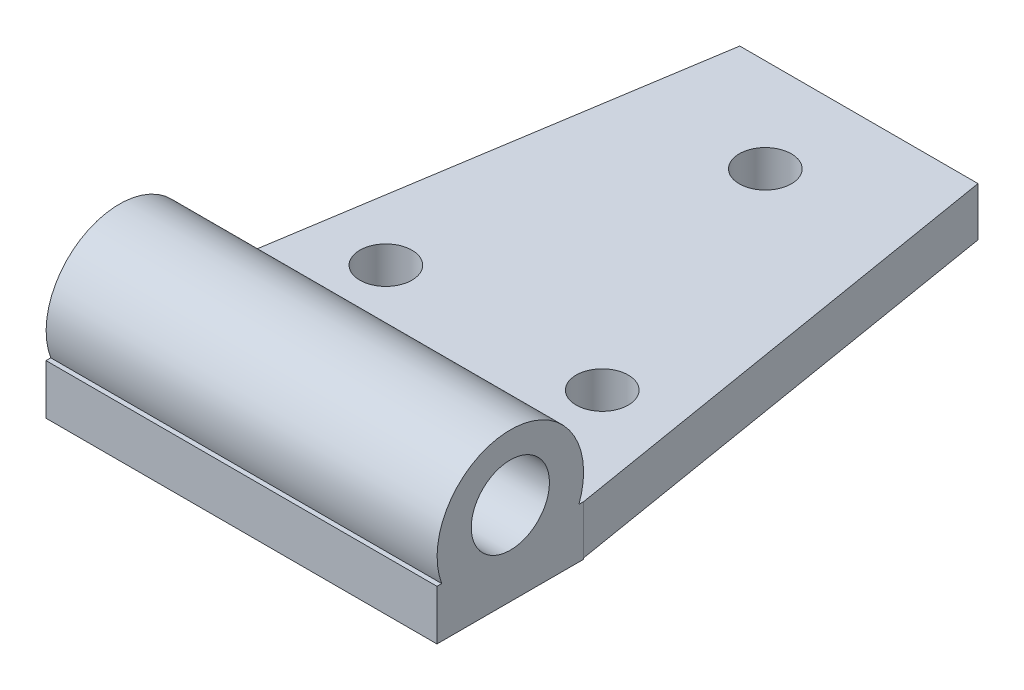
ISO-10303-21;
HEADER;
FILE_DESCRIPTION(('STEP AP214'),'2;1');
FILE_NAME('part.step','',(''),(''),'','','');
FILE_SCHEMA(('AUTOMOTIVE_DESIGN { 1 0 10303 214 1 1 1 1 }'));
ENDSEC;
DATA;
#1=APPLICATION_CONTEXT('core data for automotive mechanical design processes');
#2=APPLICATION_PROTOCOL_DEFINITION('international standard','automotive_design',2000,#1);
#3=PRODUCT_CONTEXT('',#1,'mechanical');
#4=PRODUCT('Part','Part','',(#3));
#5=PRODUCT_RELATED_PRODUCT_CATEGORY('part','',(#4));
#6=PRODUCT_DEFINITION_FORMATION('','',#4);
#7=PRODUCT_DEFINITION_CONTEXT('part definition',#1,'design');
#8=PRODUCT_DEFINITION('design','',#6,#7);
#9=PRODUCT_DEFINITION_SHAPE('','',#8);
#10=(LENGTH_UNIT() NAMED_UNIT(*) SI_UNIT(.MILLI.,.METRE.));
#11=(NAMED_UNIT(*) PLANE_ANGLE_UNIT() SI_UNIT($,.RADIAN.));
#12=(NAMED_UNIT(*) SI_UNIT($,.STERADIAN.) SOLID_ANGLE_UNIT());
#13=UNCERTAINTY_MEASURE_WITH_UNIT(LENGTH_MEASURE(1.E-05),#10,'distance_accuracy_value','');
#14=(GEOMETRIC_REPRESENTATION_CONTEXT(3) GLOBAL_UNCERTAINTY_ASSIGNED_CONTEXT((#13)) GLOBAL_UNIT_ASSIGNED_CONTEXT((#10,
#11,#12)) REPRESENTATION_CONTEXT('',''));
#15=CARTESIAN_POINT('',(0.,0.,0.));
#16=DIRECTION('',(0.,0.,1.));
#17=DIRECTION('',(1.,0.,0.));
#18=AXIS2_PLACEMENT_3D('',#15,#16,#17);
#19=CARTESIAN_POINT('',(0.,4.7498,0.));
#20=DIRECTION('',(0.,1.,0.));
#21=DIRECTION('',(0.,0.,1.));
#22=AXIS2_PLACEMENT_3D('',#19,#20,#21);
#23=PLANE('',#22);
#24=DIRECTION('',(1.,0.,0.));
#25=VECTOR('',#24,1.);
#26=CARTESIAN_POINT('',(-20.1876157601635,4.7498,13.8357003933901));
#27=LINE('',#26,#25);
#28=CARTESIAN_POINT('',(0.,4.7498,13.8357003933901));
#29=VERTEX_POINT('',#28);
#30=CARTESIAN_POINT('',(38.1,4.7498,13.8357003933901));
#31=VERTEX_POINT('',#30);
#32=EDGE_CURVE('E128',#29,#31,#27,.T.);
#33=ORIENTED_EDGE('',*,*,#32,.F.);
#34=DIRECTION('',(0.,0.,-1.));
#35=VECTOR('',#34,1.);
#36=CARTESIAN_POINT('',(0.,4.7498,14.3002));
#37=LINE('',#36,#35);
#38=CARTESIAN_POINT('',(0.,4.7498,14.3002));
#39=VERTEX_POINT('',#38);
#40=EDGE_CURVE('E138',#39,#29,#37,.T.);
#41=ORIENTED_EDGE('',*,*,#40,.F.);
#42=DIRECTION('',(-1.,0.,0.));
#43=VECTOR('',#42,1.);
#44=CARTESIAN_POINT('',(0.,4.7498,14.3002));
#45=LINE('',#44,#43);
#46=CARTESIAN_POINT('',(38.1,4.7498,14.3002));
#47=VERTEX_POINT('',#46);
#48=EDGE_CURVE('E154',#47,#39,#45,.T.);
#49=ORIENTED_EDGE('',*,*,#48,.F.);
#50=DIRECTION('',(0.,0.,-1.));
#51=VECTOR('',#50,1.);
#52=CARTESIAN_POINT('',(38.1,4.7498,14.3002));
#53=LINE('',#52,#51);
#54=EDGE_CURVE('E141',#47,#31,#53,.T.);
#55=ORIENTED_EDGE('',*,*,#54,.T.);
#56=EDGE_LOOP('',(#33,#41,#49,#55));
#57=FACE_BOUND('',#56,.T.);
#58=ADVANCED_FACE('F45',(#57),#23,.T.);
#59=CARTESIAN_POINT('',(30.4714936892043,4.7498,-46.0502));
#60=DIRECTION('',(0.986555085482987,0.,-0.163429077301609));
#61=DIRECTION('',(-0.163429077301609,0.,-0.986555085482987));
#62=AXIS2_PLACEMENT_3D('',#59,#60,#61);
#63=PLANE('',#62);
#64=DIRECTION('',(0.163429077301609,0.,0.986555085482987));
#65=VECTOR('',#64,1.);
#66=CARTESIAN_POINT('',(30.4714936892043,0.,-46.0502));
#67=LINE('',#66,#65);
#68=CARTESIAN_POINT('',(30.4714936892043,0.,-46.0502));
#69=VERTEX_POINT('',#68);
#70=CARTESIAN_POINT('',(38.1,0.,0.));
#71=VERTEX_POINT('',#70);
#72=EDGE_CURVE('E206',#69,#71,#67,.T.);
#73=ORIENTED_EDGE('',*,*,#72,.F.);
#74=DIRECTION('',(0.,-1.,0.));
#75=VECTOR('',#74,1.);
#76=CARTESIAN_POINT('',(30.4714936892043,4.7498,-46.0502));
#77=LINE('',#76,#75);
#78=CARTESIAN_POINT('',(30.4714936892043,4.7498,-46.0502));
#79=VERTEX_POINT('',#78);
#80=EDGE_CURVE('E54',#79,#69,#77,.T.);
#81=ORIENTED_EDGE('',*,*,#80,.F.);
#82=DIRECTION('',(0.163429077301609,0.,0.986555085482987));
#83=VECTOR('',#82,1.);
#84=CARTESIAN_POINT('',(30.4714936892043,4.7498,-46.0502));
#85=LINE('',#84,#83);
#86=CARTESIAN_POINT('',(38.1,4.7498,0.));
#87=VERTEX_POINT('',#86);
#88=EDGE_CURVE('E192',#79,#87,#85,.T.);
#89=ORIENTED_EDGE('',*,*,#88,.T.);
#90=DIRECTION('',(0.,-1.,0.));
#91=VECTOR('',#90,1.);
#92=CARTESIAN_POINT('',(38.1,4.7498,0.));
#93=LINE('',#92,#91);
#94=EDGE_CURVE('E11',#87,#71,#93,.T.);
#95=ORIENTED_EDGE('',*,*,#94,.T.);
#96=EDGE_LOOP('',(#73,#81,#89,#95));
#97=FACE_BOUND('',#96,.T.);
#98=ADVANCED_FACE('F47',(#97),#63,.T.);
#99=CARTESIAN_POINT('',(30.4714936892043,4.7498,-46.0502));
#100=DIRECTION('',(0.,0.,1.));
#101=DIRECTION('',(1.,0.,0.));
#102=AXIS2_PLACEMENT_3D('',#99,#100,#101);
#103=PLANE('',#102);
#104=DIRECTION('',(-1.,0.,0.));
#105=VECTOR('',#104,1.);
#106=CARTESIAN_POINT('',(30.4714936892043,0.,-46.0502));
#107=LINE('',#106,#105);
#108=CARTESIAN_POINT('',(7.25589368920428,0.,-46.0502));
#109=VERTEX_POINT('',#108);
#110=EDGE_CURVE('E209',#69,#109,#107,.T.);
#111=ORIENTED_EDGE('',*,*,#110,.T.);
#112=DIRECTION('',(0.,-1.,0.));
#113=VECTOR('',#112,1.);
#114=CARTESIAN_POINT('',(7.25589368920428,4.7498,-46.0502));
#115=LINE('',#114,#113);
#116=CARTESIAN_POINT('',(7.25589368920428,4.7498,-46.0502));
#117=VERTEX_POINT('',#116);
#118=EDGE_CURVE('E217',#117,#109,#115,.T.);
#119=ORIENTED_EDGE('',*,*,#118,.F.);
#120=DIRECTION('',(-1.,0.,0.));
#121=VECTOR('',#120,1.);
#122=CARTESIAN_POINT('',(30.4714936892043,4.7498,-46.0502));
#123=LINE('',#122,#121);
#124=EDGE_CURVE('E195',#79,#117,#123,.T.);
#125=ORIENTED_EDGE('',*,*,#124,.F.);
#126=ORIENTED_EDGE('',*,*,#80,.T.);
#127=EDGE_LOOP('',(#111,#119,#125,#126));
#128=FACE_BOUND('',#127,.T.);
#129=ADVANCED_FACE('F223',(#128),#103,.F.);
#130=CARTESIAN_POINT('',(0.,4.7498,0.));
#131=DIRECTION('',(-0.987813112473282,0.,-0.155644642779144));
#132=DIRECTION('',(-0.155644642779144,0.,0.987813112473282));
#133=AXIS2_PLACEMENT_3D('',#130,#131,#132);
#134=PLANE('',#133);
#135=DIRECTION('',(0.155644642779144,0.,-0.987813112473282));
#136=VECTOR('',#135,1.);
#137=CARTESIAN_POINT('',(0.,0.,0.));
#138=LINE('',#137,#136);
#139=CARTESIAN_POINT('',(0.,0.,0.));
#140=VERTEX_POINT('',#139);
#141=EDGE_CURVE('E196',#140,#109,#138,.T.);
#142=ORIENTED_EDGE('',*,*,#141,.F.);
#143=DIRECTION('',(0.,-1.,0.));
#144=VECTOR('',#143,1.);
#145=CARTESIAN_POINT('',(0.,4.7498,0.));
#146=LINE('',#145,#144);
#147=CARTESIAN_POINT('',(0.,4.7498,0.));
#148=VERTEX_POINT('',#147);
#149=EDGE_CURVE('E203',#148,#140,#146,.T.);
#150=ORIENTED_EDGE('',*,*,#149,.F.);
#151=DIRECTION('',(0.155644642779144,0.,-0.987813112473282));
#152=VECTOR('',#151,1.);
#153=CARTESIAN_POINT('',(0.,4.7498,0.));
#154=LINE('',#153,#152);
#155=EDGE_CURVE('E199',#148,#117,#154,.T.);
#156=ORIENTED_EDGE('',*,*,#155,.T.);
#157=ORIENTED_EDGE('',*,*,#118,.T.);
#158=EDGE_LOOP('',(#142,#150,#156,#157));
#159=FACE_BOUND('',#158,.T.);
#160=ADVANCED_FACE('F295',(#159),#134,.T.);
#161=DIRECTION('',(1.,0.,0.));
#162=VECTOR('',#161,1.);
#163=CARTESIAN_POINT('',(-20.1876157601635,4.7498,0.464499606609901));
#164=LINE('',#163,#162);
#165=CARTESIAN_POINT('',(38.1,4.7498,0.464499606609901));
#166=VERTEX_POINT('',#165);
#167=CARTESIAN_POINT('',(0.,4.7498,0.464499606609901));
#168=VERTEX_POINT('',#167);
#169=EDGE_CURVE('E130',#166,#168,#164,.F.);
#170=ORIENTED_EDGE('',*,*,#169,.F.);
#171=EDGE_CURVE('E95',#166,#87,#53,.T.);
#172=ORIENTED_EDGE('',*,*,#171,.T.);
#173=ORIENTED_EDGE('',*,*,#88,.F.);
#174=ORIENTED_EDGE('',*,*,#124,.T.);
#175=ORIENTED_EDGE('',*,*,#155,.F.);
#176=EDGE_CURVE('E67',#168,#148,#37,.T.);
#177=ORIENTED_EDGE('',*,*,#176,.F.);
#178=EDGE_LOOP('',(#170,#172,#173,#174,#175,#177));
#179=FACE_BOUND('',#178,.T.);
#180=CARTESIAN_POINT('',(18.8636936892043,4.7498,-36.9316));
#181=DIRECTION('',(0.,1.,0.));
#182=DIRECTION('',(0.,0.,1.));
#183=AXIS2_PLACEMENT_3D('',#180,#181,#182);
#184=CIRCLE('',#183,2.54);
#185=CARTESIAN_POINT('',(18.8636936892043,4.7498,-34.3916));
#186=VERTEX_POINT('',#185);
#187=EDGE_CURVE('E173',#186,#186,#184,.T.);
#188=ORIENTED_EDGE('',*,*,#187,.F.);
#189=EDGE_LOOP('',(#188));
#190=FACE_BOUND('',#189,.T.);
#191=CARTESIAN_POINT('',(8.509,4.7498,-10.3124));
#192=DIRECTION('',(0.,1.,0.));
#193=DIRECTION('',(0.,0.,1.));
#194=AXIS2_PLACEMENT_3D('',#191,#192,#193);
#195=CIRCLE('',#194,2.54);
#196=CARTESIAN_POINT('',(8.509,4.7498,-7.7724));
#197=VERTEX_POINT('',#196);
#198=EDGE_CURVE('E177',#197,#197,#195,.T.);
#199=ORIENTED_EDGE('',*,*,#198,.F.);
#200=EDGE_LOOP('',(#199));
#201=FACE_BOUND('',#200,.T.);
#202=CARTESIAN_POINT('',(29.591,4.7498,-10.3124));
#203=DIRECTION('',(0.,1.,0.));
#204=DIRECTION('',(0.,0.,1.));
#205=AXIS2_PLACEMENT_3D('',#202,#203,#204);
#206=CIRCLE('',#205,2.54);
#207=CARTESIAN_POINT('',(29.591,4.7498,-7.77240000000001));
#208=VERTEX_POINT('',#207);
#209=EDGE_CURVE('E185',#208,#208,#206,.T.);
#210=ORIENTED_EDGE('',*,*,#209,.F.);
#211=EDGE_LOOP('',(#210));
#212=FACE_BOUND('',#211,.T.);
#213=ADVANCED_FACE('F288',(#179,#190,#201,#212),#23,.T.);
#214=CARTESIAN_POINT('',(0.,0.,0.));
#215=DIRECTION('',(0.,1.,0.));
#216=DIRECTION('',(0.,0.,1.));
#217=AXIS2_PLACEMENT_3D('',#214,#215,#216);
#218=PLANE('',#217);
#219=CARTESIAN_POINT('',(18.8636936892043,0.,-36.9316));
#220=DIRECTION('',(0.,1.,0.));
#221=DIRECTION('',(0.,0.,1.));
#222=AXIS2_PLACEMENT_3D('',#219,#220,#221);
#223=CIRCLE('',#222,2.54);
#224=CARTESIAN_POINT('',(18.8636936892043,0.,-34.3916));
#225=VERTEX_POINT('',#224);
#226=EDGE_CURVE('E169',#225,#225,#223,.T.);
#227=ORIENTED_EDGE('',*,*,#226,.T.);
#228=EDGE_LOOP('',(#227));
#229=FACE_BOUND('',#228,.T.);
#230=CARTESIAN_POINT('',(8.509,0.,-10.3124));
#231=DIRECTION('',(0.,1.,0.));
#232=DIRECTION('',(0.,0.,1.));
#233=AXIS2_PLACEMENT_3D('',#230,#231,#232);
#234=CIRCLE('',#233,2.54);
#235=CARTESIAN_POINT('',(8.509,0.,-7.7724));
#236=VERTEX_POINT('',#235);
#237=EDGE_CURVE('E181',#236,#236,#234,.T.);
#238=ORIENTED_EDGE('',*,*,#237,.T.);
#239=EDGE_LOOP('',(#238));
#240=FACE_BOUND('',#239,.T.);
#241=CARTESIAN_POINT('',(29.591,0.,-10.3124));
#242=DIRECTION('',(0.,1.,0.));
#243=DIRECTION('',(0.,0.,1.));
#244=AXIS2_PLACEMENT_3D('',#241,#242,#243);
#245=CIRCLE('',#244,2.54);
#246=CARTESIAN_POINT('',(29.591,0.,-7.77240000000001));
#247=VERTEX_POINT('',#246);
#248=EDGE_CURVE('E168',#247,#247,#245,.T.);
#249=ORIENTED_EDGE('',*,*,#248,.T.);
#250=EDGE_LOOP('',(#249));
#251=FACE_BOUND('',#250,.T.);
#252=DIRECTION('',(1.,0.,0.));
#253=VECTOR('',#252,1.);
#254=CARTESIAN_POINT('',(0.,0.,0.));
#255=LINE('',#254,#253);
#256=EDGE_CURVE('E87',#140,#71,#255,.T.);
#257=ORIENTED_EDGE('',*,*,#256,.F.);
#258=ORIENTED_EDGE('',*,*,#141,.T.);
#259=ORIENTED_EDGE('',*,*,#110,.F.);
#260=ORIENTED_EDGE('',*,*,#72,.T.);
#261=EDGE_LOOP('',(#257,#258,#259,#260));
#262=FACE_BOUND('',#261,.T.);
#263=ADVANCED_FACE('F227',(#229,#240,#251,#262),#218,.F.);
#264=CARTESIAN_POINT('',(29.591,0.,-10.3124));
#265=DIRECTION('',(0.,1.,0.));
#266=DIRECTION('',(0.,0.,1.));
#267=AXIS2_PLACEMENT_3D('',#264,#265,#266);
#268=CYLINDRICAL_SURFACE('',#267,2.54);
#269=ORIENTED_EDGE('',*,*,#248,.F.);
#270=EDGE_LOOP('',(#269));
#271=FACE_BOUND('',#270,.T.);
#272=ORIENTED_EDGE('',*,*,#209,.T.);
#273=EDGE_LOOP('',(#272));
#274=FACE_BOUND('',#273,.T.);
#275=ADVANCED_FACE('F300',(#271,#274),#268,.F.);
#276=CARTESIAN_POINT('',(8.509,0.,-10.3124));
#277=DIRECTION('',(0.,1.,0.));
#278=DIRECTION('',(0.,0.,1.));
#279=AXIS2_PLACEMENT_3D('',#276,#277,#278);
#280=CYLINDRICAL_SURFACE('',#279,2.54);
#281=ORIENTED_EDGE('',*,*,#237,.F.);
#282=EDGE_LOOP('',(#281));
#283=FACE_BOUND('',#282,.T.);
#284=ORIENTED_EDGE('',*,*,#198,.T.);
#285=EDGE_LOOP('',(#284));
#286=FACE_BOUND('',#285,.T.);
#287=ADVANCED_FACE('F313',(#283,#286),#280,.F.);
#288=CARTESIAN_POINT('',(18.8636936892043,0.,-36.9316));
#289=DIRECTION('',(0.,1.,0.));
#290=DIRECTION('',(0.,0.,1.));
#291=AXIS2_PLACEMENT_3D('',#288,#289,#290);
#292=CYLINDRICAL_SURFACE('',#291,2.54);
#293=ORIENTED_EDGE('',*,*,#226,.F.);
#294=EDGE_LOOP('',(#293));
#295=FACE_BOUND('',#294,.T.);
#296=ORIENTED_EDGE('',*,*,#187,.T.);
#297=EDGE_LOOP('',(#296));
#298=FACE_BOUND('',#297,.T.);
#299=ADVANCED_FACE('F319',(#295,#298),#292,.F.);
#300=CARTESIAN_POINT('',(0.,0.,0.));
#301=DIRECTION('',(0.,0.,1.));
#302=DIRECTION('',(1.,0.,0.));
#303=AXIS2_PLACEMENT_3D('',#300,#301,#302);
#304=PLANE('',#303);
#305=DIRECTION('',(0.,-1.,0.));
#306=VECTOR('',#305,1.);
#307=CARTESIAN_POINT('',(0.,4.7498,0.));
#308=LINE('',#307,#306);
#309=CARTESIAN_POINT('',(0.,-0.11715495440715,0.));
#310=VERTEX_POINT('',#309);
#311=EDGE_CURVE('E143',#140,#310,#308,.T.);
#312=ORIENTED_EDGE('',*,*,#311,.F.);
#313=ORIENTED_EDGE('',*,*,#256,.T.);
#314=DIRECTION('',(0.,1.,0.));
#315=VECTOR('',#314,1.);
#316=CARTESIAN_POINT('',(38.1,4.7498,0.));
#317=LINE('',#316,#315);
#318=CARTESIAN_POINT('',(38.1,-0.11715495440715,0.));
#319=VERTEX_POINT('',#318);
#320=EDGE_CURVE('E156',#319,#71,#317,.T.);
#321=ORIENTED_EDGE('',*,*,#320,.F.);
#322=DIRECTION('',(1.,0.,0.));
#323=VECTOR('',#322,1.);
#324=CARTESIAN_POINT('',(0.,-0.11715495440715,0.));
#325=LINE('',#324,#323);
#326=EDGE_CURVE('E240',#310,#319,#325,.T.);
#327=ORIENTED_EDGE('',*,*,#326,.F.);
#328=EDGE_LOOP('',(#312,#313,#321,#327));
#329=FACE_BOUND('',#328,.T.);
#330=ADVANCED_FACE('F234',(#329),#304,.F.);
#331=CARTESIAN_POINT('',(0.,4.7498,14.3002));
#332=DIRECTION('',(1.,0.,0.));
#333=DIRECTION('',(0.,0.,-1.));
#334=AXIS2_PLACEMENT_3D('',#331,#332,#333);
#335=PLANE('',#334);
#336=CARTESIAN_POINT('',(0.,8.03624504559285,7.1501));
#337=DIRECTION('',(1.,0.,0.));
#338=DIRECTION('',(0.,0.,-1.));
#339=AXIS2_PLACEMENT_3D('',#336,#337,#338);
#340=CIRCLE('',#339,3.81);
#341=CARTESIAN_POINT('',(0.,8.03624504559285,3.3401));
#342=VERTEX_POINT('',#341);
#343=EDGE_CURVE('E260',#342,#342,#340,.T.);
#344=ORIENTED_EDGE('',*,*,#343,.T.);
#345=EDGE_LOOP('',(#344));
#346=FACE_BOUND('',#345,.T.);
#347=ORIENTED_EDGE('',*,*,#40,.T.);
#348=CARTESIAN_POINT('',(0.,7.24884504559285,7.1501));
#349=DIRECTION('',(1.,0.,0.));
#350=DIRECTION('',(0.,0.,-1.));
#351=AXIS2_PLACEMENT_3D('',#348,#349,#350);
#352=CIRCLE('',#351,7.1374);
#353=EDGE_CURVE('E61',#29,#168,#352,.F.);
#354=ORIENTED_EDGE('',*,*,#353,.T.);
#355=ORIENTED_EDGE('',*,*,#176,.T.);
#356=ORIENTED_EDGE('',*,*,#149,.T.);
#357=ORIENTED_EDGE('',*,*,#311,.T.);
#358=DIRECTION('',(0.,0.,-1.));
#359=VECTOR('',#358,1.);
#360=CARTESIAN_POINT('',(0.,-0.11715495440715,14.3002));
#361=LINE('',#360,#359);
#362=CARTESIAN_POINT('',(0.,-0.11715495440715,14.3002));
#363=VERTEX_POINT('',#362);
#364=EDGE_CURVE('E164',#363,#310,#361,.T.);
#365=ORIENTED_EDGE('',*,*,#364,.F.);
#366=DIRECTION('',(0.,-1.,0.));
#367=VECTOR('',#366,1.);
#368=CARTESIAN_POINT('',(0.,4.7498,14.3002));
#369=LINE('',#368,#367);
#370=EDGE_CURVE('E148',#39,#363,#369,.T.);
#371=ORIENTED_EDGE('',*,*,#370,.F.);
#372=EDGE_LOOP('',(#347,#354,#355,#356,#357,#365,#371));
#373=FACE_BOUND('',#372,.T.);
#374=ADVANCED_FACE('F145',(#346,#373),#335,.F.);
#375=CARTESIAN_POINT('',(0.,-0.11715495440715,14.3002));
#376=DIRECTION('',(0.,1.,0.));
#377=DIRECTION('',(0.,0.,1.));
#378=AXIS2_PLACEMENT_3D('',#375,#376,#377);
#379=PLANE('',#378);
#380=ORIENTED_EDGE('',*,*,#326,.T.);
#381=DIRECTION('',(0.,0.,-1.));
#382=VECTOR('',#381,1.);
#383=CARTESIAN_POINT('',(38.1,-0.11715495440715,14.3002));
#384=LINE('',#383,#382);
#385=CARTESIAN_POINT('',(38.1,-0.11715495440715,14.3002));
#386=VERTEX_POINT('',#385);
#387=EDGE_CURVE('E160',#386,#319,#384,.T.);
#388=ORIENTED_EDGE('',*,*,#387,.F.);
#389=DIRECTION('',(1.,0.,0.));
#390=VECTOR('',#389,1.);
#391=CARTESIAN_POINT('',(0.,-0.11715495440715,14.3002));
#392=LINE('',#391,#390);
#393=EDGE_CURVE('E243',#363,#386,#392,.T.);
#394=ORIENTED_EDGE('',*,*,#393,.F.);
#395=ORIENTED_EDGE('',*,*,#364,.T.);
#396=EDGE_LOOP('',(#380,#388,#394,#395));
#397=FACE_BOUND('',#396,.T.);
#398=ADVANCED_FACE('F274',(#397),#379,.F.);
#399=CARTESIAN_POINT('',(38.1,4.7498,14.3002));
#400=DIRECTION('',(-1.,0.,0.));
#401=DIRECTION('',(0.,0.,1.));
#402=AXIS2_PLACEMENT_3D('',#399,#400,#401);
#403=PLANE('',#402);
#404=CARTESIAN_POINT('',(38.1,8.03624504559285,7.1501));
#405=DIRECTION('',(1.,0.,0.));
#406=DIRECTION('',(0.,0.,-1.));
#407=AXIS2_PLACEMENT_3D('',#404,#405,#406);
#408=CIRCLE('',#407,3.81);
#409=CARTESIAN_POINT('',(38.1,8.03624504559285,3.3401));
#410=VERTEX_POINT('',#409);
#411=EDGE_CURVE('E264',#410,#410,#408,.T.);
#412=ORIENTED_EDGE('',*,*,#411,.F.);
#413=EDGE_LOOP('',(#412));
#414=FACE_BOUND('',#413,.T.);
#415=ORIENTED_EDGE('',*,*,#171,.F.);
#416=CARTESIAN_POINT('',(38.1,7.24884504559285,7.1501));
#417=DIRECTION('',(1.,0.,0.));
#418=DIRECTION('',(0.,0.,-1.));
#419=AXIS2_PLACEMENT_3D('',#416,#417,#418);
#420=CIRCLE('',#419,7.1374);
#421=EDGE_CURVE('E132',#166,#31,#420,.T.);
#422=ORIENTED_EDGE('',*,*,#421,.T.);
#423=ORIENTED_EDGE('',*,*,#54,.F.);
#424=DIRECTION('',(0.,1.,0.));
#425=VECTOR('',#424,1.);
#426=CARTESIAN_POINT('',(38.1,4.7498,14.3002));
#427=LINE('',#426,#425);
#428=EDGE_CURVE('E251',#386,#47,#427,.T.);
#429=ORIENTED_EDGE('',*,*,#428,.F.);
#430=ORIENTED_EDGE('',*,*,#387,.T.);
#431=ORIENTED_EDGE('',*,*,#320,.T.);
#432=ORIENTED_EDGE('',*,*,#94,.F.);
#433=EDGE_LOOP('',(#415,#422,#423,#429,#430,#431,#432));
#434=FACE_BOUND('',#433,.T.);
#435=ADVANCED_FACE('F236',(#414,#434),#403,.F.);
#436=CARTESIAN_POINT('',(0.,0.,14.3002));
#437=DIRECTION('',(0.,0.,1.));
#438=DIRECTION('',(1.,0.,0.));
#439=AXIS2_PLACEMENT_3D('',#436,#437,#438);
#440=PLANE('',#439);
#441=ORIENTED_EDGE('',*,*,#370,.T.);
#442=ORIENTED_EDGE('',*,*,#393,.T.);
#443=ORIENTED_EDGE('',*,*,#428,.T.);
#444=ORIENTED_EDGE('',*,*,#48,.T.);
#445=EDGE_LOOP('',(#441,#442,#443,#444));
#446=FACE_BOUND('',#445,.T.);
#447=ADVANCED_FACE('F273',(#446),#440,.T.);
#448=CARTESIAN_POINT('',(-20.1876157601635,7.24884504559285,7.1501));
#449=DIRECTION('',(1.,0.,0.));
#450=DIRECTION('',(0.,0.,-1.));
#451=AXIS2_PLACEMENT_3D('',#448,#449,#450);
#452=CYLINDRICAL_SURFACE('',#451,7.1374);
#453=ORIENTED_EDGE('',*,*,#353,.F.);
#454=ORIENTED_EDGE('',*,*,#32,.T.);
#455=ORIENTED_EDGE('',*,*,#421,.F.);
#456=ORIENTED_EDGE('',*,*,#169,.T.);
#457=EDGE_LOOP('',(#453,#454,#455,#456));
#458=FACE_BOUND('',#457,.T.);
#459=ADVANCED_FACE('F127',(#458),#452,.T.);
#460=CARTESIAN_POINT('',(-5.15620000000001,8.03624504559285,7.1501));
#461=DIRECTION('',(1.,0.,0.));
#462=DIRECTION('',(0.,0.,-1.));
#463=AXIS2_PLACEMENT_3D('',#460,#461,#462);
#464=CYLINDRICAL_SURFACE('',#463,3.81);
#465=ORIENTED_EDGE('',*,*,#411,.T.);
#466=EDGE_LOOP('',(#465));
#467=FACE_BOUND('',#466,.T.);
#468=ORIENTED_EDGE('',*,*,#343,.F.);
#469=EDGE_LOOP('',(#468));
#470=FACE_BOUND('',#469,.T.);
#471=ADVANCED_FACE('F269',(#467,#470),#464,.F.);
#472=CLOSED_SHELL('',(#58,#98,#129,#160,#213,#263,#275,#287,#299,#330,#374,#398,#435,#447,#459,#471));
#473=MANIFOLD_SOLID_BREP('B2',#472);
#474=ADVANCED_BREP_SHAPE_REPRESENTATION('',(#18,#473),#14);
#475=SHAPE_DEFINITION_REPRESENTATION(#9,#474);
ENDSEC;
END-ISO-10303-21;
